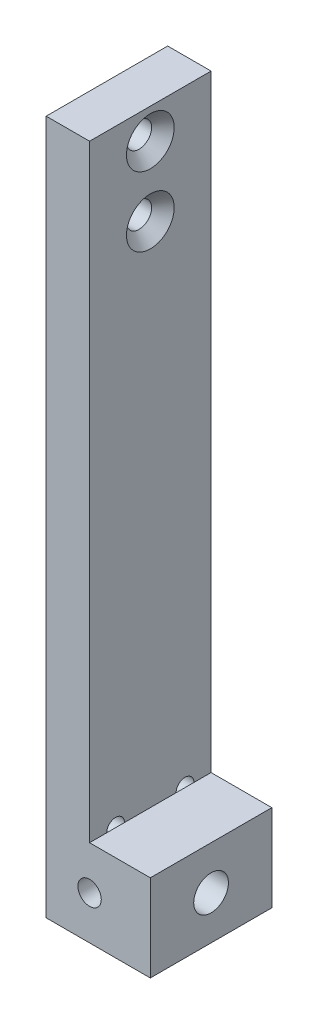
ISO-10303-21;
HEADER;
FILE_DESCRIPTION(('STEP AP214'),'2;1');
FILE_NAME('part.step','',(''),(''),'','','');
FILE_SCHEMA(('AUTOMOTIVE_DESIGN { 1 0 10303 214 1 1 1 1 }'));
ENDSEC;
DATA;
#1=APPLICATION_CONTEXT('core data for automotive mechanical design processes');
#2=APPLICATION_PROTOCOL_DEFINITION('international standard','automotive_design',2000,#1);
#3=PRODUCT_CONTEXT('',#1,'mechanical');
#4=PRODUCT('Part','Part','',(#3));
#5=PRODUCT_RELATED_PRODUCT_CATEGORY('part','',(#4));
#6=PRODUCT_DEFINITION_FORMATION('','',#4);
#7=PRODUCT_DEFINITION_CONTEXT('part definition',#1,'design');
#8=PRODUCT_DEFINITION('design','',#6,#7);
#9=PRODUCT_DEFINITION_SHAPE('','',#8);
#10=(LENGTH_UNIT() NAMED_UNIT(*) SI_UNIT(.MILLI.,.METRE.));
#11=(NAMED_UNIT(*) PLANE_ANGLE_UNIT() SI_UNIT($,.RADIAN.));
#12=(NAMED_UNIT(*) SI_UNIT($,.STERADIAN.) SOLID_ANGLE_UNIT());
#13=UNCERTAINTY_MEASURE_WITH_UNIT(LENGTH_MEASURE(1.E-05),#10,'distance_accuracy_value','');
#14=(GEOMETRIC_REPRESENTATION_CONTEXT(3) GLOBAL_UNCERTAINTY_ASSIGNED_CONTEXT((#13)) GLOBAL_UNIT_ASSIGNED_CONTEXT((#10,
#11,#12)) REPRESENTATION_CONTEXT('',''));
#15=CARTESIAN_POINT('',(0.,0.,0.));
#16=DIRECTION('',(0.,0.,1.));
#17=DIRECTION('',(1.,0.,0.));
#18=AXIS2_PLACEMENT_3D('',#15,#16,#17);
#19=CARTESIAN_POINT('',(5.,0.,0.));
#20=DIRECTION('',(-1.,0.,0.));
#21=DIRECTION('',(0.,0.,1.));
#22=AXIS2_PLACEMENT_3D('',#19,#20,#21);
#23=PLANE('',#22);
#24=CARTESIAN_POINT('',(5.,36.5,0.));
#25=DIRECTION('',(1.,0.,0.));
#26=DIRECTION('',(0.,0.,-1.));
#27=AXIS2_PLACEMENT_3D('',#24,#25,#26);
#28=CIRCLE('',#27,2.75);
#29=CARTESIAN_POINT('',(5.,36.5,-2.75));
#30=VERTEX_POINT('',#29);
#31=EDGE_CURVE('E238',#30,#30,#28,.T.);
#32=ORIENTED_EDGE('',*,*,#31,.F.);
#33=EDGE_LOOP('',(#32));
#34=FACE_BOUND('',#33,.T.);
#35=CARTESIAN_POINT('',(5.,28.5,0.));
#36=DIRECTION('',(1.,0.,0.));
#37=DIRECTION('',(0.,0.,-1.));
#38=AXIS2_PLACEMENT_3D('',#35,#36,#37);
#39=CIRCLE('',#38,2.75);
#40=CARTESIAN_POINT('',(5.,28.5,-2.75));
#41=VERTEX_POINT('',#40);
#42=EDGE_CURVE('E134',#41,#41,#39,.T.);
#43=ORIENTED_EDGE('',*,*,#42,.F.);
#44=EDGE_LOOP('',(#43));
#45=FACE_BOUND('',#44,.T.);
#46=DIRECTION('',(0.,0.,1.));
#47=VECTOR('',#46,1.);
#48=CARTESIAN_POINT('',(5.,-30.,7.));
#49=LINE('',#48,#47);
#50=CARTESIAN_POINT('',(5.,-30.,-2.97500000000001));
#51=VERTEX_POINT('',#50);
#52=CARTESIAN_POINT('',(5.,-30.,2.97500000000001));
#53=VERTEX_POINT('',#52);
#54=EDGE_CURVE('E59',#51,#53,#49,.T.);
#55=ORIENTED_EDGE('',*,*,#54,.F.);
#56=CARTESIAN_POINT('',(5.,-30.,-4.));
#57=DIRECTION('',(1.,0.,0.));
#58=DIRECTION('',(0.,0.,-1.));
#59=AXIS2_PLACEMENT_3D('',#56,#57,#58);
#60=CIRCLE('',#59,1.02499999999999);
#61=CARTESIAN_POINT('',(5.,-30.,-5.025));
#62=VERTEX_POINT('',#61);
#63=EDGE_CURVE('E105',#62,#51,#60,.T.);
#64=ORIENTED_EDGE('',*,*,#63,.F.);
#65=CARTESIAN_POINT('',(5.,-30.,-7.));
#66=VERTEX_POINT('',#65);
#67=EDGE_CURVE('E118',#66,#62,#49,.T.);
#68=ORIENTED_EDGE('',*,*,#67,.F.);
#69=DIRECTION('',(0.,1.,0.));
#70=VECTOR('',#69,1.);
#71=CARTESIAN_POINT('',(5.,-40.,-7.));
#72=LINE('',#71,#70);
#73=CARTESIAN_POINT('',(5.,40.,-7.));
#74=VERTEX_POINT('',#73);
#75=EDGE_CURVE('E156',#66,#74,#72,.T.);
#76=ORIENTED_EDGE('',*,*,#75,.T.);
#77=DIRECTION('',(0.,0.,1.));
#78=VECTOR('',#77,1.);
#79=CARTESIAN_POINT('',(5.,40.,7.));
#80=LINE('',#79,#78);
#81=CARTESIAN_POINT('',(5.,40.,7.));
#82=VERTEX_POINT('',#81);
#83=EDGE_CURVE('E158',#74,#82,#80,.T.);
#84=ORIENTED_EDGE('',*,*,#83,.T.);
#85=DIRECTION('',(0.,-1.,0.));
#86=VECTOR('',#85,1.);
#87=CARTESIAN_POINT('',(5.,-40.,7.));
#88=LINE('',#87,#86);
#89=CARTESIAN_POINT('',(5.,-30.,7.));
#90=VERTEX_POINT('',#89);
#91=EDGE_CURVE('E161',#82,#90,#88,.T.);
#92=ORIENTED_EDGE('',*,*,#91,.T.);
#93=CARTESIAN_POINT('',(5.,-30.,5.02499999999999));
#94=VERTEX_POINT('',#93);
#95=EDGE_CURVE('E121',#94,#90,#49,.T.);
#96=ORIENTED_EDGE('',*,*,#95,.F.);
#97=CARTESIAN_POINT('',(5.,-30.,4.));
#98=DIRECTION('',(1.,0.,0.));
#99=DIRECTION('',(0.,0.,-1.));
#100=AXIS2_PLACEMENT_3D('',#97,#98,#99);
#101=CIRCLE('',#100,1.02499999999999);
#102=EDGE_CURVE('E115',#53,#94,#101,.T.);
#103=ORIENTED_EDGE('',*,*,#102,.F.);
#104=EDGE_LOOP('',(#55,#64,#68,#76,#84,#92,#96,#103));
#105=FACE_BOUND('',#104,.T.);
#106=ADVANCED_FACE('F37',(#34,#45,#105),#23,.F.);
#107=CARTESIAN_POINT('',(5.,-40.,-7.));
#108=DIRECTION('',(0.,0.,1.));
#109=DIRECTION('',(1.,0.,0.));
#110=AXIS2_PLACEMENT_3D('',#107,#108,#109);
#111=PLANE('',#110);
#112=CARTESIAN_POINT('',(5.,-35.,-7.));
#113=DIRECTION('',(0.,0.,-1.));
#114=DIRECTION('',(-1.,0.,0.));
#115=AXIS2_PLACEMENT_3D('',#112,#113,#114);
#116=CIRCLE('',#115,1.35);
#117=CARTESIAN_POINT('',(3.65,-35.,-7.));
#118=VERTEX_POINT('',#117);
#119=EDGE_CURVE('E294',#118,#118,#116,.T.);
#120=ORIENTED_EDGE('',*,*,#119,.F.);
#121=EDGE_LOOP('',(#120));
#122=FACE_BOUND('',#121,.T.);
#123=DIRECTION('',(0.,1.,0.));
#124=VECTOR('',#123,1.);
#125=CARTESIAN_POINT('',(0.,-40.,-7.));
#126=LINE('',#125,#124);
#127=CARTESIAN_POINT('',(0.,-40.,-7.));
#128=VERTEX_POINT('',#127);
#129=CARTESIAN_POINT('',(0.,40.,-7.));
#130=VERTEX_POINT('',#129);
#131=EDGE_CURVE('E153',#128,#130,#126,.T.);
#132=ORIENTED_EDGE('',*,*,#131,.T.);
#133=DIRECTION('',(-1.,0.,0.));
#134=VECTOR('',#133,1.);
#135=CARTESIAN_POINT('',(5.,40.,-7.));
#136=LINE('',#135,#134);
#137=EDGE_CURVE('E11',#74,#130,#136,.T.);
#138=ORIENTED_EDGE('',*,*,#137,.F.);
#139=ORIENTED_EDGE('',*,*,#75,.F.);
#140=DIRECTION('',(-1.,0.,0.));
#141=VECTOR('',#140,1.);
#142=CARTESIAN_POINT('',(12.,-30.,-7.));
#143=LINE('',#142,#141);
#144=CARTESIAN_POINT('',(12.,-30.,-7.));
#145=VERTEX_POINT('',#144);
#146=EDGE_CURVE('E149',#145,#66,#143,.T.);
#147=ORIENTED_EDGE('',*,*,#146,.F.);
#148=DIRECTION('',(0.,1.,0.));
#149=VECTOR('',#148,1.);
#150=CARTESIAN_POINT('',(12.,-40.,-7.));
#151=LINE('',#150,#149);
#152=CARTESIAN_POINT('',(12.,-40.,-7.));
#153=VERTEX_POINT('',#152);
#154=EDGE_CURVE('E143',#153,#145,#151,.T.);
#155=ORIENTED_EDGE('',*,*,#154,.F.);
#156=DIRECTION('',(-1.,0.,0.));
#157=VECTOR('',#156,1.);
#158=CARTESIAN_POINT('',(5.,-40.,-7.));
#159=LINE('',#158,#157);
#160=EDGE_CURVE('E163',#153,#128,#159,.T.);
#161=ORIENTED_EDGE('',*,*,#160,.T.);
#162=EDGE_LOOP('',(#132,#138,#139,#147,#155,#161));
#163=FACE_BOUND('',#162,.T.);
#164=ADVANCED_FACE('F39',(#122,#163),#111,.F.);
#165=CARTESIAN_POINT('',(5.,40.,7.));
#166=DIRECTION('',(0.,-1.,0.));
#167=DIRECTION('',(0.,0.,-1.));
#168=AXIS2_PLACEMENT_3D('',#165,#166,#167);
#169=PLANE('',#168);
#170=DIRECTION('',(0.,0.,1.));
#171=VECTOR('',#170,1.);
#172=CARTESIAN_POINT('',(0.,40.,7.));
#173=LINE('',#172,#171);
#174=CARTESIAN_POINT('',(0.,40.,7.));
#175=VERTEX_POINT('',#174);
#176=EDGE_CURVE('E166',#130,#175,#173,.T.);
#177=ORIENTED_EDGE('',*,*,#176,.T.);
#178=DIRECTION('',(-1.,0.,0.));
#179=VECTOR('',#178,1.);
#180=CARTESIAN_POINT('',(5.,40.,7.));
#181=LINE('',#180,#179);
#182=EDGE_CURVE('E45',#82,#175,#181,.T.);
#183=ORIENTED_EDGE('',*,*,#182,.F.);
#184=ORIENTED_EDGE('',*,*,#83,.F.);
#185=ORIENTED_EDGE('',*,*,#137,.T.);
#186=EDGE_LOOP('',(#177,#183,#184,#185));
#187=FACE_BOUND('',#186,.T.);
#188=ADVANCED_FACE('F213',(#187),#169,.F.);
#189=CARTESIAN_POINT('',(5.,-40.,7.));
#190=DIRECTION('',(0.,0.,-1.));
#191=DIRECTION('',(-1.,0.,0.));
#192=AXIS2_PLACEMENT_3D('',#189,#190,#191);
#193=PLANE('',#192);
#194=CARTESIAN_POINT('',(5.,-35.,7.));
#195=DIRECTION('',(0.,0.,1.));
#196=DIRECTION('',(1.,0.,0.));
#197=AXIS2_PLACEMENT_3D('',#194,#195,#196);
#198=CIRCLE('',#197,1.35);
#199=CARTESIAN_POINT('',(6.35,-35.,7.));
#200=VERTEX_POINT('',#199);
#201=EDGE_CURVE('E319',#200,#200,#198,.T.);
#202=ORIENTED_EDGE('',*,*,#201,.F.);
#203=EDGE_LOOP('',(#202));
#204=FACE_BOUND('',#203,.T.);
#205=DIRECTION('',(0.,-1.,0.));
#206=VECTOR('',#205,1.);
#207=CARTESIAN_POINT('',(0.,-40.,7.));
#208=LINE('',#207,#206);
#209=CARTESIAN_POINT('',(0.,-40.,7.));
#210=VERTEX_POINT('',#209);
#211=EDGE_CURVE('E168',#175,#210,#208,.T.);
#212=ORIENTED_EDGE('',*,*,#211,.T.);
#213=DIRECTION('',(-1.,0.,0.));
#214=VECTOR('',#213,1.);
#215=CARTESIAN_POINT('',(5.,-40.,7.));
#216=LINE('',#215,#214);
#217=CARTESIAN_POINT('',(12.,-40.,7.));
#218=VERTEX_POINT('',#217);
#219=EDGE_CURVE('E173',#218,#210,#216,.T.);
#220=ORIENTED_EDGE('',*,*,#219,.F.);
#221=DIRECTION('',(0.,-1.,0.));
#222=VECTOR('',#221,1.);
#223=CARTESIAN_POINT('',(12.,-40.,7.));
#224=LINE('',#223,#222);
#225=CARTESIAN_POINT('',(12.,-30.,7.));
#226=VERTEX_POINT('',#225);
#227=EDGE_CURVE('E122',#226,#218,#224,.T.);
#228=ORIENTED_EDGE('',*,*,#227,.F.);
#229=DIRECTION('',(-1.,0.,0.));
#230=VECTOR('',#229,1.);
#231=CARTESIAN_POINT('',(12.,-30.,7.));
#232=LINE('',#231,#230);
#233=EDGE_CURVE('E145',#226,#90,#232,.T.);
#234=ORIENTED_EDGE('',*,*,#233,.T.);
#235=ORIENTED_EDGE('',*,*,#91,.F.);
#236=ORIENTED_EDGE('',*,*,#182,.T.);
#237=EDGE_LOOP('',(#212,#220,#228,#234,#235,#236));
#238=FACE_BOUND('',#237,.T.);
#239=ADVANCED_FACE('F178',(#204,#238),#193,.F.);
#240=CARTESIAN_POINT('',(5.,-40.,7.));
#241=DIRECTION('',(0.,1.,0.));
#242=DIRECTION('',(0.,0.,1.));
#243=AXIS2_PLACEMENT_3D('',#240,#241,#242);
#244=PLANE('',#243);
#245=CARTESIAN_POINT('',(8.,-40.,0.));
#246=DIRECTION('',(0.,-1.,0.));
#247=DIRECTION('',(0.,0.,-1.));
#248=AXIS2_PLACEMENT_3D('',#245,#246,#247);
#249=CIRCLE('',#248,1.35);
#250=CARTESIAN_POINT('',(8.,-40.,-1.35));
#251=VERTEX_POINT('',#250);
#252=EDGE_CURVE('E336',#251,#251,#249,.T.);
#253=ORIENTED_EDGE('',*,*,#252,.F.);
#254=EDGE_LOOP('',(#253));
#255=FACE_BOUND('',#254,.T.);
#256=DIRECTION('',(0.,0.,-1.));
#257=VECTOR('',#256,1.);
#258=CARTESIAN_POINT('',(0.,-40.,7.));
#259=LINE('',#258,#257);
#260=EDGE_CURVE('E159',#210,#128,#259,.T.);
#261=ORIENTED_EDGE('',*,*,#260,.T.);
#262=ORIENTED_EDGE('',*,*,#160,.F.);
#263=DIRECTION('',(0.,0.,-1.));
#264=VECTOR('',#263,1.);
#265=CARTESIAN_POINT('',(12.,-40.,7.));
#266=LINE('',#265,#264);
#267=EDGE_CURVE('E140',#218,#153,#266,.T.);
#268=ORIENTED_EDGE('',*,*,#267,.F.);
#269=ORIENTED_EDGE('',*,*,#219,.T.);
#270=EDGE_LOOP('',(#261,#262,#268,#269));
#271=FACE_BOUND('',#270,.T.);
#272=ADVANCED_FACE('F186',(#255,#271),#244,.F.);
#273=CARTESIAN_POINT('',(0.,0.,0.));
#274=DIRECTION('',(-1.,0.,0.));
#275=DIRECTION('',(0.,0.,1.));
#276=AXIS2_PLACEMENT_3D('',#273,#274,#275);
#277=PLANE('',#276);
#278=CARTESIAN_POINT('',(0.,-35.,0.));
#279=DIRECTION('',(-1.,0.,0.));
#280=DIRECTION('',(0.,0.,1.));
#281=AXIS2_PLACEMENT_3D('',#278,#279,#280);
#282=CIRCLE('',#281,2.);
#283=CARTESIAN_POINT('',(0.,-35.,2.));
#284=VERTEX_POINT('',#283);
#285=EDGE_CURVE('E293',#284,#284,#282,.T.);
#286=ORIENTED_EDGE('',*,*,#285,.F.);
#287=EDGE_LOOP('',(#286));
#288=FACE_BOUND('',#287,.T.);
#289=CARTESIAN_POINT('',(0.,-30.,-4.));
#290=DIRECTION('',(1.,0.,0.));
#291=DIRECTION('',(0.,0.,-1.));
#292=AXIS2_PLACEMENT_3D('',#289,#290,#291);
#293=CIRCLE('',#292,1.025);
#294=CARTESIAN_POINT('',(0.,-30.,-5.025));
#295=VERTEX_POINT('',#294);
#296=EDGE_CURVE('E111',#295,#295,#293,.T.);
#297=ORIENTED_EDGE('',*,*,#296,.T.);
#298=EDGE_LOOP('',(#297));
#299=FACE_BOUND('',#298,.T.);
#300=CARTESIAN_POINT('',(0.,-30.,4.));
#301=DIRECTION('',(1.,0.,0.));
#302=DIRECTION('',(0.,0.,-1.));
#303=AXIS2_PLACEMENT_3D('',#300,#301,#302);
#304=CIRCLE('',#303,1.025);
#305=CARTESIAN_POINT('',(0.,-30.,2.975));
#306=VERTEX_POINT('',#305);
#307=EDGE_CURVE('E236',#306,#306,#304,.T.);
#308=ORIENTED_EDGE('',*,*,#307,.T.);
#309=EDGE_LOOP('',(#308));
#310=FACE_BOUND('',#309,.T.);
#311=CARTESIAN_POINT('',(0.,36.5,0.));
#312=DIRECTION('',(1.,0.,0.));
#313=DIRECTION('',(0.,0.,-1.));
#314=AXIS2_PLACEMENT_3D('',#311,#312,#313);
#315=CIRCLE('',#314,1.45);
#316=CARTESIAN_POINT('',(0.,36.5,-1.45));
#317=VERTEX_POINT('',#316);
#318=EDGE_CURVE('E247',#317,#317,#315,.T.);
#319=ORIENTED_EDGE('',*,*,#318,.T.);
#320=EDGE_LOOP('',(#319));
#321=FACE_BOUND('',#320,.T.);
#322=CARTESIAN_POINT('',(0.,28.5,0.));
#323=DIRECTION('',(1.,0.,0.));
#324=DIRECTION('',(0.,0.,-1.));
#325=AXIS2_PLACEMENT_3D('',#322,#323,#324);
#326=CIRCLE('',#325,1.45);
#327=CARTESIAN_POINT('',(0.,28.5,-1.45));
#328=VERTEX_POINT('',#327);
#329=EDGE_CURVE('E125',#328,#328,#326,.T.);
#330=ORIENTED_EDGE('',*,*,#329,.T.);
#331=EDGE_LOOP('',(#330));
#332=FACE_BOUND('',#331,.T.);
#333=ORIENTED_EDGE('',*,*,#131,.F.);
#334=ORIENTED_EDGE('',*,*,#260,.F.);
#335=ORIENTED_EDGE('',*,*,#211,.F.);
#336=ORIENTED_EDGE('',*,*,#176,.F.);
#337=EDGE_LOOP('',(#333,#334,#335,#336));
#338=FACE_BOUND('',#337,.T.);
#339=ADVANCED_FACE('F184',(#288,#299,#310,#321,#332,#338),#277,.T.);
#340=CARTESIAN_POINT('',(12.,-30.,7.));
#341=DIRECTION('',(0.,-1.,0.));
#342=DIRECTION('',(0.,0.,-1.));
#343=AXIS2_PLACEMENT_3D('',#340,#341,#342);
#344=PLANE('',#343);
#345=ORIENTED_EDGE('',*,*,#67,.T.);
#346=EDGE_CURVE('E103',#62,#51,#49,.T.);
#347=ORIENTED_EDGE('',*,*,#346,.T.);
#348=ORIENTED_EDGE('',*,*,#54,.T.);
#349=EDGE_CURVE('E116',#53,#94,#49,.T.);
#350=ORIENTED_EDGE('',*,*,#349,.T.);
#351=ORIENTED_EDGE('',*,*,#95,.T.);
#352=ORIENTED_EDGE('',*,*,#233,.F.);
#353=DIRECTION('',(0.,0.,1.));
#354=VECTOR('',#353,1.);
#355=CARTESIAN_POINT('',(12.,-30.,7.));
#356=LINE('',#355,#354);
#357=EDGE_CURVE('E144',#145,#226,#356,.T.);
#358=ORIENTED_EDGE('',*,*,#357,.F.);
#359=ORIENTED_EDGE('',*,*,#146,.T.);
#360=EDGE_LOOP('',(#345,#347,#348,#350,#351,#352,#358,#359));
#361=FACE_BOUND('',#360,.T.);
#362=ADVANCED_FACE('F119',(#361),#344,.F.);
#363=CARTESIAN_POINT('',(12.,0.,0.));
#364=DIRECTION('',(-1.,0.,0.));
#365=DIRECTION('',(0.,0.,1.));
#366=AXIS2_PLACEMENT_3D('',#363,#364,#365);
#367=PLANE('',#366);
#368=CARTESIAN_POINT('',(12.,-35.,0.));
#369=DIRECTION('',(-1.,0.,0.));
#370=DIRECTION('',(0.,0.,1.));
#371=AXIS2_PLACEMENT_3D('',#368,#369,#370);
#372=CIRCLE('',#371,2.);
#373=CARTESIAN_POINT('',(12.,-35.,2.));
#374=VERTEX_POINT('',#373);
#375=EDGE_CURVE('E106',#374,#374,#372,.T.);
#376=ORIENTED_EDGE('',*,*,#375,.T.);
#377=EDGE_LOOP('',(#376));
#378=FACE_BOUND('',#377,.T.);
#379=ORIENTED_EDGE('',*,*,#227,.T.);
#380=ORIENTED_EDGE('',*,*,#267,.T.);
#381=ORIENTED_EDGE('',*,*,#154,.T.);
#382=ORIENTED_EDGE('',*,*,#357,.T.);
#383=EDGE_LOOP('',(#379,#380,#381,#382));
#384=FACE_BOUND('',#383,.T.);
#385=ADVANCED_FACE('F193',(#378,#384),#367,.F.);
#386=CARTESIAN_POINT('',(5.,28.5,0.));
#387=DIRECTION('',(1.,0.,0.));
#388=DIRECTION('',(0.,0.,-1.));
#389=AXIS2_PLACEMENT_3D('',#386,#387,#388);
#390=CYLINDRICAL_SURFACE('',#389,1.44999999999999);
#391=ORIENTED_EDGE('',*,*,#329,.F.);
#392=EDGE_LOOP('',(#391));
#393=FACE_BOUND('',#392,.T.);
#394=CARTESIAN_POINT('',(3.69999999999999,28.5,0.));
#395=DIRECTION('',(1.,0.,0.));
#396=DIRECTION('',(0.,0.,-1.));
#397=AXIS2_PLACEMENT_3D('',#394,#395,#396);
#398=CIRCLE('',#397,1.44999999999999);
#399=CARTESIAN_POINT('',(3.69999999999999,28.5,-1.44999999999999));
#400=VERTEX_POINT('',#399);
#401=EDGE_CURVE('E129',#400,#400,#398,.T.);
#402=ORIENTED_EDGE('',*,*,#401,.T.);
#403=EDGE_LOOP('',(#402));
#404=FACE_BOUND('',#403,.T.);
#405=ADVANCED_FACE('F195',(#393,#404),#390,.F.);
#406=CARTESIAN_POINT('',(5.,28.5,0.));
#407=DIRECTION('',(1.,0.,0.));
#408=DIRECTION('',(0.,0.,-1.));
#409=AXIS2_PLACEMENT_3D('',#406,#407,#408);
#410=CONICAL_SURFACE('',#409,2.75,0.785398163397448);
#411=ORIENTED_EDGE('',*,*,#401,.F.);
#412=EDGE_LOOP('',(#411));
#413=FACE_BOUND('',#412,.T.);
#414=ORIENTED_EDGE('',*,*,#42,.T.);
#415=EDGE_LOOP('',(#414));
#416=FACE_BOUND('',#415,.T.);
#417=ADVANCED_FACE('F202',(#413,#416),#410,.F.);
#418=CARTESIAN_POINT('',(5.,36.5,0.));
#419=DIRECTION('',(1.,0.,0.));
#420=DIRECTION('',(0.,0.,-1.));
#421=AXIS2_PLACEMENT_3D('',#418,#419,#420);
#422=CYLINDRICAL_SURFACE('',#421,1.44999999999999);
#423=ORIENTED_EDGE('',*,*,#318,.F.);
#424=EDGE_LOOP('',(#423));
#425=FACE_BOUND('',#424,.T.);
#426=CARTESIAN_POINT('',(3.69999999999999,36.5,0.));
#427=DIRECTION('',(1.,0.,0.));
#428=DIRECTION('',(0.,0.,-1.));
#429=AXIS2_PLACEMENT_3D('',#426,#427,#428);
#430=CIRCLE('',#429,1.44999999999999);
#431=CARTESIAN_POINT('',(3.69999999999999,36.5,-1.44999999999999));
#432=VERTEX_POINT('',#431);
#433=EDGE_CURVE('E244',#432,#432,#430,.T.);
#434=ORIENTED_EDGE('',*,*,#433,.T.);
#435=EDGE_LOOP('',(#434));
#436=FACE_BOUND('',#435,.T.);
#437=ADVANCED_FACE('F253',(#425,#436),#422,.F.);
#438=CARTESIAN_POINT('',(5.,36.5,0.));
#439=DIRECTION('',(1.,0.,0.));
#440=DIRECTION('',(0.,0.,-1.));
#441=AXIS2_PLACEMENT_3D('',#438,#439,#440);
#442=CONICAL_SURFACE('',#441,2.75,0.78539816339745);
#443=ORIENTED_EDGE('',*,*,#433,.F.);
#444=EDGE_LOOP('',(#443));
#445=FACE_BOUND('',#444,.T.);
#446=ORIENTED_EDGE('',*,*,#31,.T.);
#447=EDGE_LOOP('',(#446));
#448=FACE_BOUND('',#447,.T.);
#449=ADVANCED_FACE('F259',(#445,#448),#442,.F.);
#450=CARTESIAN_POINT('',(5.,-28.975,4.));
#451=DIRECTION('',(1.,0.,0.));
#452=DIRECTION('',(0.,0.,-1.));
#453=AXIS2_PLACEMENT_3D('',#450,#451,#452);
#454=PLANE('',#453);
#455=EDGE_CURVE('E232',#94,#53,#101,.T.);
#456=ORIENTED_EDGE('',*,*,#455,.F.);
#457=ORIENTED_EDGE('',*,*,#349,.F.);
#458=EDGE_LOOP('',(#456,#457));
#459=FACE_BOUND('',#458,.T.);
#460=ADVANCED_FACE('F231',(#459),#454,.F.);
#461=CARTESIAN_POINT('',(5.,-30.,4.));
#462=DIRECTION('',(1.,0.,0.));
#463=DIRECTION('',(0.,0.,-1.));
#464=AXIS2_PLACEMENT_3D('',#461,#462,#463);
#465=CYLINDRICAL_SURFACE('',#464,1.02499999999999);
#466=ORIENTED_EDGE('',*,*,#307,.F.);
#467=EDGE_LOOP('',(#466));
#468=FACE_BOUND('',#467,.T.);
#469=ORIENTED_EDGE('',*,*,#102,.T.);
#470=ORIENTED_EDGE('',*,*,#455,.T.);
#471=EDGE_LOOP('',(#469,#470));
#472=FACE_BOUND('',#471,.T.);
#473=ADVANCED_FACE('F235',(#468,#472),#465,.F.);
#474=CARTESIAN_POINT('',(5.,-28.975,-4.));
#475=DIRECTION('',(1.,0.,0.));
#476=DIRECTION('',(0.,0.,-1.));
#477=AXIS2_PLACEMENT_3D('',#474,#475,#476);
#478=PLANE('',#477);
#479=EDGE_CURVE('E51',#51,#62,#60,.T.);
#480=ORIENTED_EDGE('',*,*,#479,.F.);
#481=ORIENTED_EDGE('',*,*,#346,.F.);
#482=EDGE_LOOP('',(#480,#481));
#483=FACE_BOUND('',#482,.T.);
#484=ADVANCED_FACE('F102',(#483),#478,.F.);
#485=CARTESIAN_POINT('',(5.,-30.,-4.));
#486=DIRECTION('',(1.,0.,0.));
#487=DIRECTION('',(0.,0.,-1.));
#488=AXIS2_PLACEMENT_3D('',#485,#486,#487);
#489=CYLINDRICAL_SURFACE('',#488,1.02499999999999);
#490=ORIENTED_EDGE('',*,*,#296,.F.);
#491=EDGE_LOOP('',(#490));
#492=FACE_BOUND('',#491,.T.);
#493=ORIENTED_EDGE('',*,*,#63,.T.);
#494=ORIENTED_EDGE('',*,*,#479,.T.);
#495=EDGE_LOOP('',(#493,#494));
#496=FACE_BOUND('',#495,.T.);
#497=ADVANCED_FACE('F108',(#492,#496),#489,.F.);
#498=CARTESIAN_POINT('',(12.,-35.,0.));
#499=DIRECTION('',(-1.,0.,0.));
#500=DIRECTION('',(0.,0.,1.));
#501=AXIS2_PLACEMENT_3D('',#498,#499,#500);
#502=CYLINDRICAL_SURFACE('',#501,2.);
#503=CARTESIAN_POINT('',(8.,-36.4756354563374,-1.35));
#504=CARTESIAN_POINT('',(8.06563613103853,-36.4756402669146,-1.34999732420168));
#505=CARTESIAN_POINT('',(8.13128768210785,-36.4800966160302,-1.34517179869902));
#506=CARTESIAN_POINT('',(8.26022020595043,-36.497029232219,-1.32629252592756));
#507=CARTESIAN_POINT('',(8.32349661027695,-36.5095201927819,-1.31222187038928));
#508=CARTESIAN_POINT('',(8.445397154682,-36.5402662854188,-1.2759826490888));
#509=CARTESIAN_POINT('',(8.50406102367524,-36.5584633519828,-1.25389531953543));
#510=CARTESIAN_POINT('',(8.61674652837187,-36.5984670506503,-1.20248218253732));
#511=CARTESIAN_POINT('',(8.67076734255696,-36.6202743195355,-1.17315509766735));
#512=CARTESIAN_POINT('',(8.78211877899649,-36.6692274547927,-1.10263439367894));
#513=CARTESIAN_POINT('',(8.83859216805374,-36.696668775519,-1.06029221829813));
#514=CARTESIAN_POINT('',(8.94438756380707,-36.7513765738254,-0.96726376896539));
#515=CARTESIAN_POINT('',(8.99370153413127,-36.7786428225871,-0.916568252632396));
#516=CARTESIAN_POINT('',(9.09113272182204,-36.8347354905545,-0.799117849117705));
#517=CARTESIAN_POINT('',(9.13796109271405,-36.8631825402722,-0.731094717715904));
#518=CARTESIAN_POINT('',(9.21907232112646,-36.9138012443749,-0.585869065255357));
#519=CARTESIAN_POINT('',(9.25337824411106,-36.9359844191272,-0.508683771480746));
#520=CARTESIAN_POINT('',(9.30045868648688,-36.9668418600976,-0.367887079950251));
#521=CARTESIAN_POINT('',(9.31648666181344,-36.977514996016,-0.305793694725355));
#522=CARTESIAN_POINT('',(9.33958657955992,-36.9929667212434,-0.179257797884658));
#523=CARTESIAN_POINT('',(9.34666534150844,-36.9977497988547,-0.114817113544265));
#524=CARTESIAN_POINT('',(9.35147709185854,-37.0009965785957,0.014680091873783));
#525=CARTESIAN_POINT('',(9.34919468745616,-36.9994498725104,0.0797374516183539));
#526=CARTESIAN_POINT('',(9.33538510976815,-36.9901577132295,0.208414094969863));
#527=CARTESIAN_POINT('',(9.32385520784465,-36.9824104304454,0.272032948422414));
#528=CARTESIAN_POINT('',(9.29245156273957,-36.9615800665645,0.395005279974244));
#529=CARTESIAN_POINT('',(9.27272767848666,-36.9485929336817,0.454413991192181));
#530=CARTESIAN_POINT('',(9.22580231568083,-36.9182729977908,0.568986160192636));
#531=CARTESIAN_POINT('',(9.1985994209811,-36.9009393718312,0.624148811451384));
#532=CARTESIAN_POINT('',(9.13413775969902,-36.860929177493,0.735404309013811));
#533=CARTESIAN_POINT('',(9.09609110372573,-36.8378705806877,0.790901045096737));
#534=CARTESIAN_POINT('',(9.0127898473593,-36.7894395612352,0.895106413322226));
#535=CARTESIAN_POINT('',(8.96752683672349,-36.7640644537615,0.943806999201831));
#536=CARTESIAN_POINT('',(8.86241321788757,-36.7084893409425,1.04149990873228));
#537=CARTESIAN_POINT('',(8.80138893490128,-36.6781920354262,1.08917936904102));
#538=CARTESIAN_POINT('',(8.67124287337666,-36.6200869760681,1.17386185140333));
#539=CARTESIAN_POINT('',(8.60212596008884,-36.5922777439707,1.21087124237962));
#540=CARTESIAN_POINT('',(8.47384937916382,-36.5489722618869,1.26554406077341));
#541=CARTESIAN_POINT('',(8.41622314845648,-36.5321202797059,1.28571456706783));
#542=CARTESIAN_POINT('',(8.29749496459152,-36.5042251361935,1.31824520551446));
#543=CARTESIAN_POINT('',(8.23639954504457,-36.4931714322525,1.33061952124094));
#544=CARTESIAN_POINT('',(8.11165541699309,-36.4785523585191,1.34685276857582));
#545=CARTESIAN_POINT('',(8.04799038127862,-36.4750466878771,1.35064382523411));
#546=CARTESIAN_POINT('',(7.92085016815124,-36.4763887105908,1.3491763703727));
#547=CARTESIAN_POINT('',(7.85737500353786,-36.4812369549285,1.34391726195007));
#548=CARTESIAN_POINT('',(7.73959613252307,-36.4974192707672,1.32584145851697));
#549=CARTESIAN_POINT('',(7.68504343974237,-36.5079944097321,1.31390453310863));
#550=CARTESIAN_POINT('',(7.57880746632807,-36.5337017434824,1.28380301759108));
#551=CARTESIAN_POINT('',(7.52712682760684,-36.5488380543755,1.26563280035558));
#552=CARTESIAN_POINT('',(7.4047598739217,-36.5896984167251,1.21423164019256));
#553=CARTESIAN_POINT('',(7.33594257707313,-36.6171266523268,1.17790082375768));
#554=CARTESIAN_POINT('',(7.20617884858688,-36.6745917302945,1.09467263194284));
#555=CARTESIAN_POINT('',(7.14524716796168,-36.7046332906337,1.04775589133952));
#556=CARTESIAN_POINT('',(7.03126329570553,-36.7645328742523,0.943446462837678));
#557=CARTESIAN_POINT('',(6.97832556702729,-36.794383257176,0.885923825968586));
#558=CARTESIAN_POINT('',(6.88256889493495,-36.8505821053983,0.761567463861275));
#559=CARTESIAN_POINT('',(6.83973380517099,-36.8769361287818,0.694748871253981));
#560=CARTESIAN_POINT('',(6.77243314181229,-36.9193408100479,0.565591255834112));
#561=CARTESIAN_POINT('',(6.74605365755615,-36.9363908544959,0.504580201758782));
#562=CARTESIAN_POINT('',(6.70232914105503,-36.9649871514099,0.378170991137788));
#563=CARTESIAN_POINT('',(6.6849782924505,-36.9765369467969,0.312775689711179));
#564=CARTESIAN_POINT('',(6.660181873309,-36.9931197809791,0.178981896873088));
#565=CARTESIAN_POINT('',(6.65278250040045,-36.998122423129,0.110570911082536));
#566=CARTESIAN_POINT('',(6.64851959139236,-37.0009987803437,-0.0267281927315906));
#567=CARTESIAN_POINT('',(6.65165416865775,-36.998873771974,-0.0956162231109464));
#568=CARTESIAN_POINT('',(6.66759185639593,-36.9881603721071,-0.226230617830366));
#569=CARTESIAN_POINT('',(6.67962355336826,-36.9800878470228,-0.288097111486516));
#570=CARTESIAN_POINT('',(6.7118410921711,-36.9587516642586,-0.40871226372262));
#571=CARTESIAN_POINT('',(6.73202823644943,-36.9454871774185,-0.467460422599456));
#572=CARTESIAN_POINT('',(6.78100069713122,-36.9139200427876,-0.583722715440879));
#573=CARTESIAN_POINT('',(6.8101879911365,-36.8953859567914,-0.641002961986222));
#574=CARTESIAN_POINT('',(6.87570698446476,-36.8549583026536,-0.750010316877202));
#575=CARTESIAN_POINT('',(6.91204264137287,-36.8330628750368,-0.801734324457567));
#576=CARTESIAN_POINT('',(6.99728504207124,-36.7836874954947,-0.906828909437031));
#577=CARTESIAN_POINT('',(7.04727110493993,-36.7558719969878,-0.959166089521626));
#578=CARTESIAN_POINT('',(7.15485677183761,-36.6998976951939,-1.05519630014687));
#579=CARTESIAN_POINT('',(7.21246269404186,-36.6717386248096,-1.09888208129482));
#580=CARTESIAN_POINT('',(7.3311650970836,-36.619311384429,-1.17466084938707));
#581=CARTESIAN_POINT('',(7.39186751563741,-36.5949124043755,-1.20727785967788));
#582=CARTESIAN_POINT('',(7.51898525606318,-36.5509168365093,-1.26330069044649));
#583=CARTESIAN_POINT('',(7.58539039304426,-36.5313119181106,-1.28672253277991));
#584=CARTESIAN_POINT('',(7.70962877834932,-36.5029638690468,-1.31965219994732));
#585=CARTESIAN_POINT('',(7.76666400846422,-36.4928588077121,-1.33096688803776));
#586=CARTESIAN_POINT('',(7.88246344636336,-36.4791962923817,-1.34613760611657));
#587=CARTESIAN_POINT('',(7.94122554093144,-36.475631148663,-1.35000239606748));
#588=CARTESIAN_POINT('',(8.,-36.4756354563374,-1.35));
#589=B_SPLINE_CURVE_WITH_KNOTS('',3,(#503,#504,#505,#506,#507,#508,#509,#510,#511,#512,#513,
#514,#515,#516,#517,#518,#519,#520,#521,#522,#523,#524,#525,#526,#527,#528,#529,#530,#531,#532,
#533,#534,#535,#536,#537,#538,#539,#540,#541,#542,#543,#544,#545,#546,#547,#548,#549,#550,#551,
#552,#553,#554,#555,#556,#557,#558,#559,#560,#561,#562,#563,#564,#565,#566,#567,#568,#569,#570,
#571,#572,#573,#574,#575,#576,#577,#578,#579,#580,#581,#582,#583,#584,#585,#586,#587,#588),
.UNSPECIFIED.,.T.,.F.,(4,2,2,2,2,2,2,2,2,2,2,2,2,2,2,2,2,2,2,2,2,2,2,2,2,2,2,2,2,2,2,2,2,2,2,2,
2,2,2,2,2,2,4),(0.,0.196638578594613,0.393637791097073,0.588694053424217,0.783784757262221,
1.01014392904437,1.23675525401582,1.4973550068482,1.75747230186428,1.95166111458761,
2.14570186111812,2.34006180159418,2.53447911251944,2.72548721585802,2.91653151142186,
3.1291115865236,3.34194124719866,3.59035837057579,3.83862690628886,4.02793538917255,
4.21689846184042,4.40735067953033,4.59781545896238,4.76766167493796,4.93766162545025,
5.18389031119257,5.43057313764477,5.68050793807616,5.93004053628791,6.13504984296117,
6.3399269160683,6.54575184223073,6.75153990702395,6.94131303005311,7.13111647237064,
7.33106720770747,7.53112895592312,7.76283198324929,7.99472835090457,8.21322440278307,
8.43133803461733,8.60762722038806,8.78370898977398),.UNSPECIFIED.);
#590=CARTESIAN_POINT('',(8.,-36.4756354563374,-1.35));
#591=VERTEX_POINT('',#590);
#592=EDGE_CURVE('E331',#591,#591,#589,.T.);
#593=ORIENTED_EDGE('',*,*,#592,.T.);
#594=EDGE_LOOP('',(#593));
#595=FACE_BOUND('',#594,.T.);
#596=CARTESIAN_POINT('',(6.35,-35.,2.));
#597=CARTESIAN_POINT('',(6.34999771331462,-35.0676282271041,1.99999779170123));
#598=CARTESIAN_POINT('',(6.34488780934711,-35.1352776590272,1.99653849291545));
#599=CARTESIAN_POINT('',(6.32476087565859,-35.2684250938433,1.9830373770726));
#600=CARTESIAN_POINT('',(6.30973590430542,-35.3339213279139,1.97299028345689));
#601=CARTESIAN_POINT('',(6.27071094861015,-35.4606188587683,1.94730383170857));
#602=CARTESIAN_POINT('',(6.24675481824332,-35.521839434022,1.93169181476083));
#603=CARTESIAN_POINT('',(6.19089831626532,-35.6391287812259,1.8961212428857));
#604=CARTESIAN_POINT('',(6.15899717209936,-35.6951970514517,1.87616226529361));
#605=CARTESIAN_POINT('',(6.0851846937779,-35.8060285034275,1.83144422461705));
#606=CARTESIAN_POINT('',(6.04264931355256,-35.8602669143994,1.80642024000079));
#607=CARTESIAN_POINT('',(5.9502819444714,-35.9613326627081,1.75472774937108));
#608=CARTESIAN_POINT('',(5.9004393529796,-36.0081490217754,1.72805688687809));
#609=CARTESIAN_POINT('',(5.78549660944055,-36.1008187378495,1.67081342550613));
#610=CARTESIAN_POINT('',(5.71923308271313,-36.1452824343322,1.64031016741128));
#611=CARTESIAN_POINT('',(5.57847427809018,-36.2224075121492,1.58366940930256));
#612=CARTESIAN_POINT('',(5.50399349619911,-36.255089256543,1.5575244192466));
#613=CARTESIAN_POINT('',(5.37098327389376,-36.2993194118912,1.5206389914766));
#614=CARTESIAN_POINT('',(5.31421686527257,-36.3142571587528,1.50762947447478));
#615=CARTESIAN_POINT('',(5.19821727543935,-36.3366693381597,1.48779848964414));
#616=CARTESIAN_POINT('',(5.13898863537873,-36.3441569259738,1.48096611635564));
#617=CARTESIAN_POINT('',(5.01938251712775,-36.3511943727699,1.47455099802661));
#618=CARTESIAN_POINT('',(4.95900108439909,-36.3507085659282,1.47500082691155));
#619=CARTESIAN_POINT('',(4.83931789680339,-36.3417484484521,1.48315319533031));
#620=CARTESIAN_POINT('',(4.78001696082573,-36.3332683164057,1.49086102008151));
#621=CARTESIAN_POINT('',(4.6670146788774,-36.309501781766,1.51176576448829));
#622=CARTESIAN_POINT('',(4.61318140362412,-36.2945715445238,1.52467333361018));
#623=CARTESIAN_POINT('',(4.50873919190826,-36.2586571108411,1.55445372494254));
#624=CARTESIAN_POINT('',(4.45813277415128,-36.2376682543244,1.57132959757271));
#625=CARTESIAN_POINT('',(4.33715953534018,-36.1788079681238,1.61627778695679));
#626=CARTESIAN_POINT('',(4.26892977314793,-36.1376644928511,1.64584272203451));
#627=CARTESIAN_POINT('',(4.14103137335076,-36.0444850166197,1.70650325518768));
#628=CARTESIAN_POINT('',(4.08137860438136,-35.9924292526982,1.73760155105272));
#629=CARTESIAN_POINT('',(3.97116818703657,-35.8777114707939,1.79829635223503));
#630=CARTESIAN_POINT('',(3.92068712736039,-35.814967924664,1.82787885095595));
#631=CARTESIAN_POINT('',(3.83102547397701,-35.6800918987866,1.88221497764853));
#632=CARTESIAN_POINT('',(3.79182163215483,-35.6079791860177,1.90697850536949));
#633=CARTESIAN_POINT('',(3.73386334451706,-35.4728068800885,1.94428125162735));
#634=CARTESIAN_POINT('',(3.71250351637256,-35.4112746294685,1.95831290266027));
#635=CARTESIAN_POINT('',(3.67876369867152,-35.2847952439356,1.98065736207627));
#636=CARTESIAN_POINT('',(3.66637768641707,-35.2198504307882,1.98897400584289));
#637=CARTESIAN_POINT('',(3.65124392538707,-35.0881207029273,1.99915259880798));
#638=CARTESIAN_POINT('',(3.64852716584268,-35.0213305619988,2.00099379445717));
#639=CARTESIAN_POINT('',(3.65298787724396,-34.8882319605988,1.99798370769556));
#640=CARTESIAN_POINT('',(3.66016604104114,-34.8219235341843,1.99313195663853));
#641=CARTESIAN_POINT('',(3.68337795058816,-34.6951148060177,1.97760577751887));
#642=CARTESIAN_POINT('',(3.69894831030888,-34.6344901028996,1.96723636635373));
#643=CARTESIAN_POINT('',(3.73788193403299,-34.516887009726,1.94170712217467));
#644=CARTESIAN_POINT('',(3.76124662096309,-34.4599092877263,1.92654641449174));
#645=CARTESIAN_POINT('',(3.81713543828932,-34.3460252668986,1.89107461360942));
#646=CARTESIAN_POINT('',(3.85025751279239,-34.2895150212582,1.87044114423665));
#647=CARTESIAN_POINT('',(3.92363779522912,-34.1825916873592,1.82625225659435));
#648=CARTESIAN_POINT('',(3.96390168248844,-34.1321835056702,1.80269451739021));
#649=CARTESIAN_POINT('',(4.05800122195214,-34.0300878900963,1.75016770369711));
#650=CARTESIAN_POINT('',(4.11298031958261,-33.9795806472343,1.72095005096079));
#651=CARTESIAN_POINT('',(4.23077859787392,-33.8880813219639,1.6632979484526));
#652=CARTESIAN_POINT('',(4.29360045498775,-33.8470925015758,1.63486377011572));
#653=CARTESIAN_POINT('',(4.41663299292657,-33.7808560637272,1.58591479837463));
#654=CARTESIAN_POINT('',(4.47584949712785,-33.754175537741,1.56485090288172));
#655=CARTESIAN_POINT('',(4.59894232472527,-33.7092933876164,1.52804581172885));
#656=CARTESIAN_POINT('',(4.66280923606459,-33.6910751594793,1.51229420952747));
#657=CARTESIAN_POINT('',(4.78374458456373,-33.6662356459174,1.49040462854726));
#658=CARTESIAN_POINT('',(4.84032590287262,-33.6582515736909,1.48315262210534));
#659=CARTESIAN_POINT('',(4.95448815152955,-33.6495562456655,1.4752424252377));
#660=CARTESIAN_POINT('',(5.01206825845327,-33.6488392598694,1.47457903978375));
#661=CARTESIAN_POINT('',(5.12646504145599,-33.6547170594416,1.47994147670541));
#662=CARTESIAN_POINT('',(5.18328239720449,-33.6613048279426,1.48596087967423));
#663=CARTESIAN_POINT('',(5.29477768136162,-33.6813546621065,1.5037784736854));
#664=CARTESIAN_POINT('',(5.34945254564231,-33.6948262122491,1.51558463681272));
#665=CARTESIAN_POINT('',(5.47308930946022,-33.7334510153393,1.54812054846543));
#666=CARTESIAN_POINT('',(5.54086554218861,-33.7609851777348,1.57050651130464));
#667=CARTESIAN_POINT('',(5.66995230533346,-33.8257348570297,1.61949032322797));
#668=CARTESIAN_POINT('',(5.73125296748004,-33.8629648587928,1.64609445047457));
#669=CARTESIAN_POINT('',(5.84797266151238,-33.9470469871417,1.70113617266384));
#670=CARTESIAN_POINT('',(5.90325661631667,-33.9940696880138,1.72959911857047));
#671=CARTESIAN_POINT('',(6.00590532359868,-34.09671563396,1.78535455312655));
#672=CARTESIAN_POINT('',(6.05326802611321,-34.152341098221,1.8126467374368));
#673=CARTESIAN_POINT('',(6.1438296120179,-34.2783185659693,1.86664983651362));
#674=CARTESIAN_POINT('',(6.1859669268096,-34.3496223449122,1.89295279599895));
#675=CARTESIAN_POINT('',(6.256994645589,-34.5006216206536,1.93824300346185));
#676=CARTESIAN_POINT('',(6.28591584299636,-34.5802970727654,1.95724724071722));
#677=CARTESIAN_POINT('',(6.32126989937002,-34.7172786709868,1.98069412894931));
#678=CARTESIAN_POINT('',(6.33200056539478,-34.7730343582404,1.98788795561871));
#679=CARTESIAN_POINT('',(6.34636530714285,-34.8858553133749,1.99754097338309));
#680=CARTESIAN_POINT('',(6.35000193001902,-34.9429201037669,2.00000186385878));
#681=CARTESIAN_POINT('',(6.35,-35.,2.));
#682=B_SPLINE_CURVE_WITH_KNOTS('',3,(#596,#597,#598,#599,#600,#601,#602,#603,#604,#605,#606,
#607,#608,#609,#610,#611,#612,#613,#614,#615,#616,#617,#618,#619,#620,#621,#622,#623,#624,#625,
#626,#627,#628,#629,#630,#631,#632,#633,#634,#635,#636,#637,#638,#639,#640,#641,#642,#643,#644,
#645,#646,#647,#648,#649,#650,#651,#652,#653,#654,#655,#656,#657,#658,#659,#660,#661,#662,#663,
#664,#665,#666,#667,#668,#669,#670,#671,#672,#673,#674,#675,#676,#677,#678,#679,#680,#681),
.UNSPECIFIED.,.T.,.F.,(4,2,2,2,2,2,2,2,2,2,2,2,2,2,2,2,2,2,2,2,2,2,2,2,2,2,2,2,2,2,2,2,2,2,2,2,
2,2,2,2,2,2,4),(0.,0.202651464163276,0.405465442599551,0.607296401705922,0.80914699405578,
1.02831710184136,1.24780842813815,1.50292539701383,1.75759930234987,1.93726294016847,
2.11660876728148,2.29675704471727,2.477036606288,2.64842825957878,2.81995209416525,
3.07358269375797,3.32767666824589,3.58380364628825,3.83939876824866,4.03843994393391,
4.23734741082049,4.43689179006302,4.63645014229376,4.82597510880703,5.01553469381259,
5.22078002338758,5.42618930631756,5.6657429970656,5.90537866353731,6.10947965323961,
6.31317846389868,6.4852026754597,6.6570912377473,6.82881482868604,7.0007756610565,
7.22905726038458,7.45768187153471,7.69068363076873,7.92374559619127,8.18292790049508,
8.44150319435651,8.61260748921183,8.78365033686966),.UNSPECIFIED.);
#683=CARTESIAN_POINT('',(6.35,-35.,2.));
#684=VERTEX_POINT('',#683);
#685=EDGE_CURVE('E313',#684,#684,#682,.T.);
#686=ORIENTED_EDGE('',*,*,#685,.F.);
#687=EDGE_LOOP('',(#686));
#688=FACE_BOUND('',#687,.T.);
#689=CARTESIAN_POINT('',(3.65,-35.,-2.));
#690=CARTESIAN_POINT('',(3.65000228668538,-34.9323717728959,-1.99999779170123));
#691=CARTESIAN_POINT('',(3.65511219065289,-34.8647223409728,-1.99653849291546));
#692=CARTESIAN_POINT('',(3.67523912434142,-34.7315749061567,-1.9830373770726));
#693=CARTESIAN_POINT('',(3.69026409569458,-34.6660786720861,-1.97299028345689));
#694=CARTESIAN_POINT('',(3.72928905138985,-34.5393811412317,-1.94730383170858));
#695=CARTESIAN_POINT('',(3.75324518175668,-34.478160565978,-1.93169181476084));
#696=CARTESIAN_POINT('',(3.80910168373468,-34.3608712187741,-1.89612124288571));
#697=CARTESIAN_POINT('',(3.84100282790064,-34.3048029485483,-1.87616226529363));
#698=CARTESIAN_POINT('',(3.9148153062221,-34.1939714965725,-1.83144422461707));
#699=CARTESIAN_POINT('',(3.95735068644744,-34.1397330856006,-1.8064202400008));
#700=CARTESIAN_POINT('',(4.04971805552859,-34.0386673372919,-1.7547277493711));
#701=CARTESIAN_POINT('',(4.09956064702039,-33.9918509782246,-1.72805688687811));
#702=CARTESIAN_POINT('',(4.21450339055945,-33.8991812621505,-1.67081342550615));
#703=CARTESIAN_POINT('',(4.28076691728686,-33.8547175656678,-1.64031016741131));
#704=CARTESIAN_POINT('',(4.42152572190981,-33.7775924878508,-1.58366940930259));
#705=CARTESIAN_POINT('',(4.49600650380087,-33.7449107434571,-1.55752441924663));
#706=CARTESIAN_POINT('',(4.62901672610623,-33.7006805881088,-1.52063899147663));
#707=CARTESIAN_POINT('',(4.68578313472741,-33.6857428412472,-1.50762947447481));
#708=CARTESIAN_POINT('',(4.80178272456064,-33.6633306618403,-1.48779848964417));
#709=CARTESIAN_POINT('',(4.86101136462126,-33.6558430740262,-1.48096611635566));
#710=CARTESIAN_POINT('',(4.98061748287224,-33.6488056272301,-1.47455099802663));
#711=CARTESIAN_POINT('',(5.0409989156009,-33.6492914340718,-1.47500082691158));
#712=CARTESIAN_POINT('',(5.1606821031966,-33.6582515515479,-1.48315319533034));
#713=CARTESIAN_POINT('',(5.21998303917426,-33.6667316835943,-1.49086102008153));
#714=CARTESIAN_POINT('',(5.3329853211226,-33.690498218234,-1.51176576448831));
#715=CARTESIAN_POINT('',(5.38681859637588,-33.7054284554762,-1.5246733336102));
#716=CARTESIAN_POINT('',(5.49126080809174,-33.7413428891589,-1.55445372494256));
#717=CARTESIAN_POINT('',(5.54186722584872,-33.7623317456756,-1.57132959757273));
#718=CARTESIAN_POINT('',(5.66284046465982,-33.8211920318762,-1.61627778695681));
#719=CARTESIAN_POINT('',(5.73107022685207,-33.8623355071489,-1.64584272203453));
#720=CARTESIAN_POINT('',(5.85896862664924,-33.9555149833803,-1.7065032551877));
#721=CARTESIAN_POINT('',(5.91862139561863,-34.0075707473018,-1.73760155105274));
#722=CARTESIAN_POINT('',(6.02883181296343,-34.1222885292061,-1.79829635223504));
#723=CARTESIAN_POINT('',(6.0793128726396,-34.185032075336,-1.82787885095596));
#724=CARTESIAN_POINT('',(6.16897452602299,-34.3199081012134,-1.88221497764854));
#725=CARTESIAN_POINT('',(6.20817836784517,-34.3920208139823,-1.9069785053695));
#726=CARTESIAN_POINT('',(6.26613665548294,-34.5271931199115,-1.94428125162736));
#727=CARTESIAN_POINT('',(6.28749648362744,-34.5887253705315,-1.95831290266027));
#728=CARTESIAN_POINT('',(6.32123630132849,-34.7152047560644,-1.98065736207628));
#729=CARTESIAN_POINT('',(6.33362231358293,-34.7801495692118,-1.9889740058429));
#730=CARTESIAN_POINT('',(6.34875607461294,-34.9118792970727,-1.99915259880798));
#731=CARTESIAN_POINT('',(6.35147283415732,-34.9786694380013,-2.00099379445717));
#732=CARTESIAN_POINT('',(6.34701212275604,-35.1117680394012,-1.99798370769555));
#733=CARTESIAN_POINT('',(6.33983395895886,-35.1780764658157,-1.99313195663853));
#734=CARTESIAN_POINT('',(6.31662204941184,-35.3048851939823,-1.97760577751887));
#735=CARTESIAN_POINT('',(6.30105168969112,-35.3655098971004,-1.96723636635373));
#736=CARTESIAN_POINT('',(6.26211806596702,-35.483112990274,-1.94170712217466));
#737=CARTESIAN_POINT('',(6.23875337903691,-35.5400907122737,-1.92654641449173));
#738=CARTESIAN_POINT('',(6.18286456171068,-35.6539747331014,-1.89107461360941));
#739=CARTESIAN_POINT('',(6.14974248720761,-35.7104849787418,-1.87044114423664));
#740=CARTESIAN_POINT('',(6.07636220477088,-35.8174083126408,-1.82625225659433));
#741=CARTESIAN_POINT('',(6.03609831751156,-35.8678164943298,-1.80269451739019));
#742=CARTESIAN_POINT('',(5.94199877804785,-35.9699121099037,-1.75016770369709));
#743=CARTESIAN_POINT('',(5.88701968041739,-36.0204193527657,-1.72095005096076));
#744=CARTESIAN_POINT('',(5.76922140212608,-36.1119186780361,-1.66329794845258));
#745=CARTESIAN_POINT('',(5.70639954501224,-36.1529074984243,-1.6348637701157));
#746=CARTESIAN_POINT('',(5.58336700707342,-36.2191439362728,-1.5859147983746));
#747=CARTESIAN_POINT('',(5.52415050287213,-36.245824462259,-1.56485090288169));
#748=CARTESIAN_POINT('',(5.40105767527472,-36.2907066123836,-1.52804581172882));
#749=CARTESIAN_POINT('',(5.33719076393541,-36.3089248405207,-1.51229420952744));
#750=CARTESIAN_POINT('',(5.21625541543627,-36.3337643540826,-1.49040462854724));
#751=CARTESIAN_POINT('',(5.15967409712738,-36.3417484263091,-1.48315262210532));
#752=CARTESIAN_POINT('',(5.04551184847045,-36.3504437543345,-1.47524242523768));
#753=CARTESIAN_POINT('',(4.98793174154673,-36.3511607401307,-1.47457903978373));
#754=CARTESIAN_POINT('',(4.87353495854401,-36.3452829405584,-1.47994147670538));
#755=CARTESIAN_POINT('',(4.81671760279551,-36.3386951720574,-1.4859608796742));
#756=CARTESIAN_POINT('',(4.70522231863838,-36.3186453378935,-1.50377847368537));
#757=CARTESIAN_POINT('',(4.65054745435769,-36.3051737877509,-1.5155846368127));
#758=CARTESIAN_POINT('',(4.52691069053979,-36.2665489846607,-1.5481205484654));
#759=CARTESIAN_POINT('',(4.45913445781139,-36.2390148222652,-1.57050651130462));
#760=CARTESIAN_POINT('',(4.33004769466654,-36.1742651429703,-1.61949032322795));
#761=CARTESIAN_POINT('',(4.26874703251996,-36.1370351412072,-1.64609445047455));
#762=CARTESIAN_POINT('',(4.15202733848762,-36.0529530128583,-1.70113617266382));
#763=CARTESIAN_POINT('',(4.09674338368334,-36.0059303119862,-1.72959911857045));
#764=CARTESIAN_POINT('',(3.99409467640132,-35.90328436604,-1.78535455312653));
#765=CARTESIAN_POINT('',(3.9467319738868,-35.847658901779,-1.81264673743679));
#766=CARTESIAN_POINT('',(3.8561703879821,-35.7216814340307,-1.8666498365136));
#767=CARTESIAN_POINT('',(3.81403307319041,-35.6503776550878,-1.89295279599894));
#768=CARTESIAN_POINT('',(3.743005354411,-35.4993783793464,-1.93824300346184));
#769=CARTESIAN_POINT('',(3.71408415700365,-35.4197029272346,-1.95724724071721));
#770=CARTESIAN_POINT('',(3.67873010062998,-35.2827213290132,-1.98069412894931));
#771=CARTESIAN_POINT('',(3.66799943460523,-35.2269656417596,-1.98788795561871));
#772=CARTESIAN_POINT('',(3.65363469285716,-35.1141446866251,-1.99754097338308));
#773=CARTESIAN_POINT('',(3.64999806998099,-35.0570798962331,-2.00000186385878));
#774=CARTESIAN_POINT('',(3.65,-35.,-2.));
#775=B_SPLINE_CURVE_WITH_KNOTS('',3,(#689,#690,#691,#692,#693,#694,#695,#696,#697,#698,#699,
#700,#701,#702,#703,#704,#705,#706,#707,#708,#709,#710,#711,#712,#713,#714,#715,#716,#717,#718,
#719,#720,#721,#722,#723,#724,#725,#726,#727,#728,#729,#730,#731,#732,#733,#734,#735,#736,#737,
#738,#739,#740,#741,#742,#743,#744,#745,#746,#747,#748,#749,#750,#751,#752,#753,#754,#755,#756,
#757,#758,#759,#760,#761,#762,#763,#764,#765,#766,#767,#768,#769,#770,#771,#772,#773,#774),
.UNSPECIFIED.,.T.,.F.,(4,2,2,2,2,2,2,2,2,2,2,2,2,2,2,2,2,2,2,2,2,2,2,2,2,2,2,2,2,2,2,2,2,2,2,2,
2,2,2,2,2,2,4),(0.,0.202651464163276,0.405465442599544,0.607296401705921,0.809146994055769,
1.02831710184134,1.24780842813813,1.50292539701381,1.75759930234984,1.93726294016845,
2.11660876728146,2.29675704471725,2.47703660628799,2.64842825957877,2.81995209416525,
3.07358269375795,3.32767666824587,3.58380364628824,3.83939876824864,4.0384399439339,
4.23734741082048,4.43689179006301,4.63645014229375,4.82597510880702,5.01553469381258,
5.22078002338757,5.42618930631756,5.6657429970656,5.90537866353732,6.10947965323962,
6.31317846389868,6.4852026754597,6.65709123774729,6.82881482868604,7.00077566105649,
7.22905726038457,7.4576818715347,7.69068363076872,7.92374559619125,8.18292790049507,
8.4415031943565,8.61260748921183,8.78365033686966),.UNSPECIFIED.);
#776=CARTESIAN_POINT('',(3.65,-35.,-2.));
#777=VERTEX_POINT('',#776);
#778=EDGE_CURVE('E287',#777,#777,#775,.T.);
#779=ORIENTED_EDGE('',*,*,#778,.T.);
#780=EDGE_LOOP('',(#779));
#781=FACE_BOUND('',#780,.T.);
#782=ORIENTED_EDGE('',*,*,#375,.F.);
#783=EDGE_LOOP('',(#782));
#784=FACE_BOUND('',#783,.T.);
#785=ORIENTED_EDGE('',*,*,#285,.T.);
#786=EDGE_LOOP('',(#785));
#787=FACE_BOUND('',#786,.T.);
#788=ADVANCED_FACE('F276',(#595,#688,#781,#784,#787),#502,.F.);
#789=CARTESIAN_POINT('',(5.,-35.,-7.));
#790=DIRECTION('',(0.,0.,-1.));
#791=DIRECTION('',(-1.,0.,0.));
#792=AXIS2_PLACEMENT_3D('',#789,#790,#791);
#793=CYLINDRICAL_SURFACE('',#792,1.35);
#794=ORIENTED_EDGE('',*,*,#778,.F.);
#795=EDGE_LOOP('',(#794));
#796=FACE_BOUND('',#795,.T.);
#797=ORIENTED_EDGE('',*,*,#119,.T.);
#798=EDGE_LOOP('',(#797));
#799=FACE_BOUND('',#798,.T.);
#800=ADVANCED_FACE('F280',(#796,#799),#793,.F.);
#801=CARTESIAN_POINT('',(5.,-35.,7.));
#802=DIRECTION('',(0.,0.,1.));
#803=DIRECTION('',(1.,0.,0.));
#804=AXIS2_PLACEMENT_3D('',#801,#802,#803);
#805=CYLINDRICAL_SURFACE('',#804,1.35);
#806=ORIENTED_EDGE('',*,*,#685,.T.);
#807=EDGE_LOOP('',(#806));
#808=FACE_BOUND('',#807,.T.);
#809=ORIENTED_EDGE('',*,*,#201,.T.);
#810=EDGE_LOOP('',(#809));
#811=FACE_BOUND('',#810,.T.);
#812=ADVANCED_FACE('F321',(#808,#811),#805,.F.);
#813=CARTESIAN_POINT('',(8.,-40.,0.));
#814=DIRECTION('',(0.,-1.,0.));
#815=DIRECTION('',(0.,0.,-1.));
#816=AXIS2_PLACEMENT_3D('',#813,#814,#815);
#817=CYLINDRICAL_SURFACE('',#816,1.35);
#818=ORIENTED_EDGE('',*,*,#592,.F.);
#819=EDGE_LOOP('',(#818));
#820=FACE_BOUND('',#819,.T.);
#821=ORIENTED_EDGE('',*,*,#252,.T.);
#822=EDGE_LOOP('',(#821));
#823=FACE_BOUND('',#822,.T.);
#824=ADVANCED_FACE('F326',(#820,#823),#817,.F.);
#825=CLOSED_SHELL('',(#106,#164,#188,#239,#272,#339,#362,#385,#405,#417,#437,#449,#460,#473,
#484,#497,#788,#800,#812,#824));
#826=MANIFOLD_SOLID_BREP('B2',#825);
#827=ADVANCED_BREP_SHAPE_REPRESENTATION('',(#18,#826),#14);
#828=SHAPE_DEFINITION_REPRESENTATION(#9,#827);
ENDSEC;
END-ISO-10303-21;
